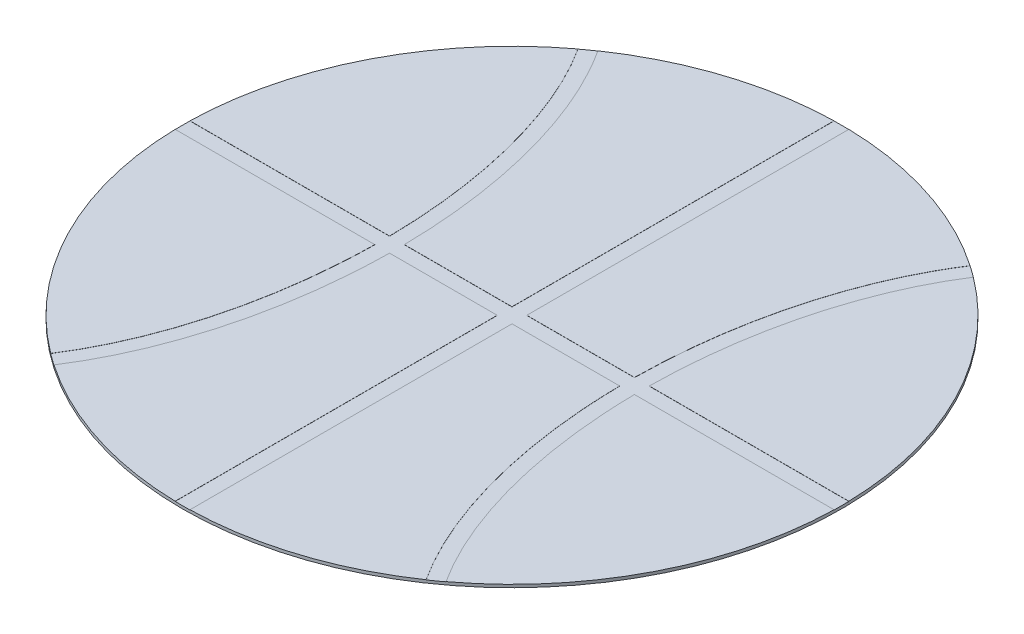
ISO-10303-21;
HEADER;
FILE_DESCRIPTION(('STEP AP214'),'2;1');
FILE_NAME('part.step','',(''),(''),'','','');
FILE_SCHEMA(('AUTOMOTIVE_DESIGN { 1 0 10303 214 1 1 1 1 }'));
ENDSEC;
DATA;
#1=APPLICATION_CONTEXT('core data for automotive mechanical design processes');
#2=APPLICATION_PROTOCOL_DEFINITION('international standard','automotive_design',2000,#1);
#3=PRODUCT_CONTEXT('',#1,'mechanical');
#4=PRODUCT('Part','Part','',(#3));
#5=PRODUCT_RELATED_PRODUCT_CATEGORY('part','',(#4));
#6=PRODUCT_DEFINITION_FORMATION('','',#4);
#7=PRODUCT_DEFINITION_CONTEXT('part definition',#1,'design');
#8=PRODUCT_DEFINITION('design','',#6,#7);
#9=PRODUCT_DEFINITION_SHAPE('','',#8);
#10=(LENGTH_UNIT() NAMED_UNIT(*) SI_UNIT(.MILLI.,.METRE.));
#11=(NAMED_UNIT(*) PLANE_ANGLE_UNIT() SI_UNIT($,.RADIAN.));
#12=(NAMED_UNIT(*) SI_UNIT($,.STERADIAN.) SOLID_ANGLE_UNIT());
#13=UNCERTAINTY_MEASURE_WITH_UNIT(LENGTH_MEASURE(1.E-05),#10,'distance_accuracy_value','');
#14=(GEOMETRIC_REPRESENTATION_CONTEXT(3) GLOBAL_UNCERTAINTY_ASSIGNED_CONTEXT((#13)) GLOBAL_UNIT_ASSIGNED_CONTEXT((#10,
#11,#12)) REPRESENTATION_CONTEXT('',''));
#15=CARTESIAN_POINT('',(0.,0.,0.));
#16=DIRECTION('',(0.,0.,1.));
#17=DIRECTION('',(1.,0.,0.));
#18=AXIS2_PLACEMENT_3D('',#15,#16,#17);
#19=CARTESIAN_POINT('',(0.,0.2,0.));
#20=DIRECTION('',(0.,-1.,0.));
#21=DIRECTION('',(0.,0.,-1.));
#22=AXIS2_PLACEMENT_3D('',#19,#20,#21);
#23=CYLINDRICAL_SURFACE('',#22,22.3);
#24=CARTESIAN_POINT('',(0.,0.,0.));
#25=DIRECTION('',(0.,1.,0.));
#26=DIRECTION('',(0.,0.,1.));
#27=AXIS2_PLACEMENT_3D('',#24,#25,#26);
#28=CIRCLE('',#27,22.3);
#29=CARTESIAN_POINT('',(0.,0.,22.3));
#30=VERTEX_POINT('',#29);
#31=EDGE_CURVE('E35',#30,#30,#28,.T.);
#32=ORIENTED_EDGE('',*,*,#31,.T.);
#33=EDGE_LOOP('',(#32));
#34=FACE_BOUND('',#33,.T.);
#35=CARTESIAN_POINT('',(0.,0.2,0.));
#36=DIRECTION('',(0.,1.,0.));
#37=DIRECTION('',(0.,0.,1.));
#38=AXIS2_PLACEMENT_3D('',#35,#36,#37);
#39=CIRCLE('',#38,22.3);
#40=CARTESIAN_POINT('',(13.3767482010341,0.2,17.8424383862221));
#41=VERTEX_POINT('',#40);
#42=CARTESIAN_POINT('',(22.294393914166,0.2,0.499999999999994));
#43=VERTEX_POINT('',#42);
#44=EDGE_CURVE('E40',#41,#43,#39,.T.);
#45=ORIENTED_EDGE('',*,*,#44,.F.);
#46=DIRECTION('',(0.,1.,0.));
#47=VECTOR('',#46,1.);
#48=CARTESIAN_POINT('',(13.3767482010341,0.19,17.8424383862221));
#49=LINE('',#48,#47);
#50=CARTESIAN_POINT('',(13.3767482010341,0.19,17.8424383862221));
#51=VERTEX_POINT('',#50);
#52=EDGE_CURVE('E322',#51,#41,#49,.T.);
#53=ORIENTED_EDGE('',*,*,#52,.F.);
#54=CARTESIAN_POINT('',(0.,0.19,0.));
#55=DIRECTION('',(0.,1.,0.));
#56=DIRECTION('',(0.,0.,1.));
#57=AXIS2_PLACEMENT_3D('',#54,#55,#56);
#58=CIRCLE('',#57,22.3);
#59=CARTESIAN_POINT('',(12.591992016773,0.19,18.4046661759872));
#60=VERTEX_POINT('',#59);
#61=EDGE_CURVE('E514',#60,#51,#58,.T.);
#62=ORIENTED_EDGE('',*,*,#61,.F.);
#63=DIRECTION('',(0.,1.,0.));
#64=VECTOR('',#63,1.);
#65=CARTESIAN_POINT('',(12.591992016773,0.19,18.4046661759872));
#66=LINE('',#65,#64);
#67=CARTESIAN_POINT('',(12.591992016773,0.2,18.4046661759872));
#68=VERTEX_POINT('',#67);
#69=EDGE_CURVE('E324',#60,#68,#66,.T.);
#70=ORIENTED_EDGE('',*,*,#69,.T.);
#71=CARTESIAN_POINT('',(0.500000000000003,0.2,22.294393914166));
#72=VERTEX_POINT('',#71);
#73=EDGE_CURVE('E11',#72,#68,#39,.T.);
#74=ORIENTED_EDGE('',*,*,#73,.F.);
#75=DIRECTION('',(0.,1.,0.));
#76=VECTOR('',#75,1.);
#77=CARTESIAN_POINT('',(0.500000000000003,0.19,22.294393914166));
#78=LINE('',#77,#76);
#79=CARTESIAN_POINT('',(0.500000000000003,0.19,22.294393914166));
#80=VERTEX_POINT('',#79);
#81=EDGE_CURVE('E331',#80,#72,#78,.T.);
#82=ORIENTED_EDGE('',*,*,#81,.F.);
#83=CARTESIAN_POINT('',(0.,0.19,0.));
#84=DIRECTION('',(0.,1.,0.));
#85=DIRECTION('',(0.,0.,1.));
#86=AXIS2_PLACEMENT_3D('',#83,#84,#85);
#87=CIRCLE('',#86,22.3);
#88=CARTESIAN_POINT('',(-0.499999999999997,0.19,22.294393914166));
#89=VERTEX_POINT('',#88);
#90=EDGE_CURVE('E492',#89,#80,#87,.T.);
#91=ORIENTED_EDGE('',*,*,#90,.F.);
#92=DIRECTION('',(0.,1.,0.));
#93=VECTOR('',#92,1.);
#94=CARTESIAN_POINT('',(-0.499999999999997,0.19,22.294393914166));
#95=LINE('',#94,#93);
#96=CARTESIAN_POINT('',(-0.499999999999997,0.2,22.294393914166));
#97=VERTEX_POINT('',#96);
#98=EDGE_CURVE('E333',#89,#97,#95,.T.);
#99=ORIENTED_EDGE('',*,*,#98,.T.);
#100=CARTESIAN_POINT('',(-12.591992016773,0.2,18.4046661759872));
#101=VERTEX_POINT('',#100);
#102=EDGE_CURVE('E41',#101,#97,#39,.T.);
#103=ORIENTED_EDGE('',*,*,#102,.F.);
#104=DIRECTION('',(0.,1.,0.));
#105=VECTOR('',#104,1.);
#106=CARTESIAN_POINT('',(-12.591992016773,0.19,18.4046661759872));
#107=LINE('',#106,#105);
#108=CARTESIAN_POINT('',(-12.591992016773,0.19,18.4046661759872));
#109=VERTEX_POINT('',#108);
#110=EDGE_CURVE('E340',#109,#101,#107,.T.);
#111=ORIENTED_EDGE('',*,*,#110,.F.);
#112=CARTESIAN_POINT('',(0.,0.19,0.));
#113=DIRECTION('',(0.,1.,0.));
#114=DIRECTION('',(0.,0.,1.));
#115=AXIS2_PLACEMENT_3D('',#112,#113,#114);
#116=CIRCLE('',#115,22.3);
#117=CARTESIAN_POINT('',(-13.3767482010341,0.19,17.8424383862221));
#118=VERTEX_POINT('',#117);
#119=EDGE_CURVE('E431',#118,#109,#116,.T.);
#120=ORIENTED_EDGE('',*,*,#119,.F.);
#121=DIRECTION('',(0.,1.,0.));
#122=VECTOR('',#121,1.);
#123=CARTESIAN_POINT('',(-13.3767482010341,0.19,17.8424383862221));
#124=LINE('',#123,#122);
#125=CARTESIAN_POINT('',(-13.3767482010341,0.2,17.8424383862221));
#126=VERTEX_POINT('',#125);
#127=EDGE_CURVE('E342',#118,#126,#124,.T.);
#128=ORIENTED_EDGE('',*,*,#127,.T.);
#129=CARTESIAN_POINT('',(-22.294393914166,0.2,0.499999999999999));
#130=VERTEX_POINT('',#129);
#131=EDGE_CURVE('E480',#130,#126,#39,.T.);
#132=ORIENTED_EDGE('',*,*,#131,.F.);
#133=DIRECTION('',(0.,1.,0.));
#134=VECTOR('',#133,1.);
#135=CARTESIAN_POINT('',(-22.294393914166,0.19,0.499999999999999));
#136=LINE('',#135,#134);
#137=CARTESIAN_POINT('',(-22.294393914166,0.19,0.499999999999999));
#138=VERTEX_POINT('',#137);
#139=EDGE_CURVE('E347',#138,#130,#136,.T.);
#140=ORIENTED_EDGE('',*,*,#139,.F.);
#141=CARTESIAN_POINT('',(0.,0.19,0.));
#142=DIRECTION('',(0.,1.,0.));
#143=DIRECTION('',(0.,0.,1.));
#144=AXIS2_PLACEMENT_3D('',#141,#142,#143);
#145=CIRCLE('',#144,22.3);
#146=CARTESIAN_POINT('',(-22.294393914166,0.19,-0.500000000000001));
#147=VERTEX_POINT('',#146);
#148=EDGE_CURVE('E418',#147,#138,#145,.T.);
#149=ORIENTED_EDGE('',*,*,#148,.F.);
#150=DIRECTION('',(0.,1.,0.));
#151=VECTOR('',#150,1.);
#152=CARTESIAN_POINT('',(-22.294393914166,0.19,-0.500000000000001));
#153=LINE('',#152,#151);
#154=CARTESIAN_POINT('',(-22.294393914166,0.2,-0.500000000000001));
#155=VERTEX_POINT('',#154);
#156=EDGE_CURVE('E349',#147,#155,#153,.T.);
#157=ORIENTED_EDGE('',*,*,#156,.T.);
#158=CARTESIAN_POINT('',(-13.3767482010341,0.2,-17.8424383862221));
#159=VERTEX_POINT('',#158);
#160=EDGE_CURVE('E358',#159,#155,#39,.T.);
#161=ORIENTED_EDGE('',*,*,#160,.F.);
#162=DIRECTION('',(0.,1.,0.));
#163=VECTOR('',#162,1.);
#164=CARTESIAN_POINT('',(-13.3767482010341,0.19,-17.8424383862221));
#165=LINE('',#164,#163);
#166=CARTESIAN_POINT('',(-13.3767482010341,0.19,-17.8424383862221));
#167=VERTEX_POINT('',#166);
#168=EDGE_CURVE('E141',#167,#159,#165,.T.);
#169=ORIENTED_EDGE('',*,*,#168,.F.);
#170=CARTESIAN_POINT('',(0.,0.19,0.));
#171=DIRECTION('',(0.,1.,0.));
#172=DIRECTION('',(0.,0.,1.));
#173=AXIS2_PLACEMENT_3D('',#170,#171,#172);
#174=CIRCLE('',#173,22.3);
#175=CARTESIAN_POINT('',(-12.591992016773,0.19,-18.4046661759872));
#176=VERTEX_POINT('',#175);
#177=EDGE_CURVE('E239',#176,#167,#174,.T.);
#178=ORIENTED_EDGE('',*,*,#177,.F.);
#179=DIRECTION('',(0.,1.,0.));
#180=VECTOR('',#179,1.);
#181=CARTESIAN_POINT('',(-12.591992016773,0.19,-18.4046661759872));
#182=LINE('',#181,#180);
#183=CARTESIAN_POINT('',(-12.591992016773,0.2,-18.4046661759872));
#184=VERTEX_POINT('',#183);
#185=EDGE_CURVE('E230',#176,#184,#182,.T.);
#186=ORIENTED_EDGE('',*,*,#185,.T.);
#187=CARTESIAN_POINT('',(-0.500000000000003,0.2,-22.294393914166));
#188=VERTEX_POINT('',#187);
#189=EDGE_CURVE('E296',#188,#184,#39,.T.);
#190=ORIENTED_EDGE('',*,*,#189,.F.);
#191=DIRECTION('',(0.,1.,0.));
#192=VECTOR('',#191,1.);
#193=CARTESIAN_POINT('',(-0.500000000000003,0.19,-22.294393914166));
#194=LINE('',#193,#192);
#195=CARTESIAN_POINT('',(-0.500000000000003,0.19,-22.294393914166));
#196=VERTEX_POINT('',#195);
#197=EDGE_CURVE('E293',#196,#188,#194,.T.);
#198=ORIENTED_EDGE('',*,*,#197,.F.);
#199=CARTESIAN_POINT('',(0.,0.19,0.));
#200=DIRECTION('',(0.,1.,0.));
#201=DIRECTION('',(0.,0.,1.));
#202=AXIS2_PLACEMENT_3D('',#199,#200,#201);
#203=CIRCLE('',#202,22.3);
#204=CARTESIAN_POINT('',(0.499999999999997,0.19,-22.294393914166));
#205=VERTEX_POINT('',#204);
#206=EDGE_CURVE('E245',#205,#196,#203,.T.);
#207=ORIENTED_EDGE('',*,*,#206,.F.);
#208=DIRECTION('',(0.,1.,0.));
#209=VECTOR('',#208,1.);
#210=CARTESIAN_POINT('',(0.499999999999997,0.19,-22.294393914166));
#211=LINE('',#210,#209);
#212=CARTESIAN_POINT('',(0.499999999999997,0.2,-22.294393914166));
#213=VERTEX_POINT('',#212);
#214=EDGE_CURVE('E299',#205,#213,#211,.T.);
#215=ORIENTED_EDGE('',*,*,#214,.T.);
#216=CARTESIAN_POINT('',(12.591992016773,0.2,-18.4046661759872));
#217=VERTEX_POINT('',#216);
#218=EDGE_CURVE('E474',#217,#213,#39,.T.);
#219=ORIENTED_EDGE('',*,*,#218,.F.);
#220=DIRECTION('',(0.,1.,0.));
#221=VECTOR('',#220,1.);
#222=CARTESIAN_POINT('',(12.591992016773,0.19,-18.4046661759872));
#223=LINE('',#222,#221);
#224=CARTESIAN_POINT('',(12.591992016773,0.19,-18.4046661759872));
#225=VERTEX_POINT('',#224);
#226=EDGE_CURVE('E308',#225,#217,#223,.T.);
#227=ORIENTED_EDGE('',*,*,#226,.F.);
#228=CARTESIAN_POINT('',(0.,0.19,0.));
#229=DIRECTION('',(0.,1.,0.));
#230=DIRECTION('',(0.,0.,1.));
#231=AXIS2_PLACEMENT_3D('',#228,#229,#230);
#232=CIRCLE('',#231,22.3);
#233=CARTESIAN_POINT('',(13.3767482010341,0.19,-17.8424383862221));
#234=VERTEX_POINT('',#233);
#235=EDGE_CURVE('E283',#234,#225,#232,.T.);
#236=ORIENTED_EDGE('',*,*,#235,.F.);
#237=DIRECTION('',(0.,1.,0.));
#238=VECTOR('',#237,1.);
#239=CARTESIAN_POINT('',(13.3767482010341,0.19,-17.8424383862221));
#240=LINE('',#239,#238);
#241=CARTESIAN_POINT('',(13.3767482010341,0.2,-17.8424383862221));
#242=VERTEX_POINT('',#241);
#243=EDGE_CURVE('E310',#234,#242,#240,.T.);
#244=ORIENTED_EDGE('',*,*,#243,.T.);
#245=CARTESIAN_POINT('',(22.294393914166,0.2,-0.500000000000006));
#246=VERTEX_POINT('',#245);
#247=EDGE_CURVE('E478',#246,#242,#39,.T.);
#248=ORIENTED_EDGE('',*,*,#247,.F.);
#249=DIRECTION('',(0.,1.,0.));
#250=VECTOR('',#249,1.);
#251=CARTESIAN_POINT('',(22.294393914166,0.19,-0.500000000000006));
#252=LINE('',#251,#250);
#253=CARTESIAN_POINT('',(22.294393914166,0.19,-0.500000000000006));
#254=VERTEX_POINT('',#253);
#255=EDGE_CURVE('E315',#254,#246,#252,.T.);
#256=ORIENTED_EDGE('',*,*,#255,.F.);
#257=CARTESIAN_POINT('',(0.,0.19,0.));
#258=DIRECTION('',(0.,1.,0.));
#259=DIRECTION('',(0.,0.,1.));
#260=AXIS2_PLACEMENT_3D('',#257,#258,#259);
#261=CIRCLE('',#260,22.3);
#262=CARTESIAN_POINT('',(22.294393914166,0.19,0.499999999999994));
#263=VERTEX_POINT('',#262);
#264=EDGE_CURVE('E572',#263,#254,#261,.T.);
#265=ORIENTED_EDGE('',*,*,#264,.F.);
#266=DIRECTION('',(0.,1.,0.));
#267=VECTOR('',#266,1.);
#268=CARTESIAN_POINT('',(22.294393914166,0.19,0.499999999999994));
#269=LINE('',#268,#267);
#270=EDGE_CURVE('E317',#263,#43,#269,.T.);
#271=ORIENTED_EDGE('',*,*,#270,.T.);
#272=EDGE_LOOP('',(#45,#53,#62,#70,#74,#82,#91,#99,#103,#111,#120,#128,#132,#140,#149,#157,#161,
#169,#178,#186,#190,#198,#207,#215,#219,#227,#236,#244,#248,#256,#265,#271));
#273=FACE_BOUND('',#272,.T.);
#274=ADVANCED_FACE('F32',(#34,#273),#23,.T.);
#275=CARTESIAN_POINT('',(0.,0.2,0.));
#276=DIRECTION('',(0.,1.,0.));
#277=DIRECTION('',(0.,0.,1.));
#278=AXIS2_PLACEMENT_3D('',#275,#276,#277);
#279=PLANE('',#278);
#280=ORIENTED_EDGE('',*,*,#218,.T.);
#281=DIRECTION('',(0.,0.,1.));
#282=VECTOR('',#281,1.);
#283=CARTESIAN_POINT('',(0.5,0.2,0.));
#284=LINE('',#283,#282);
#285=CARTESIAN_POINT('',(0.5,0.2,-0.500000000000005));
#286=VERTEX_POINT('',#285);
#287=EDGE_CURVE('E368',#213,#286,#284,.T.);
#288=ORIENTED_EDGE('',*,*,#287,.T.);
#289=DIRECTION('',(-1.,0.,0.));
#290=VECTOR('',#289,1.);
#291=CARTESIAN_POINT('',(0.,0.2,-0.500000000000004));
#292=LINE('',#291,#290);
#293=CARTESIAN_POINT('',(7.78559095930401,0.2,-0.500000000000005));
#294=VERTEX_POINT('',#293);
#295=EDGE_CURVE('E371',#294,#286,#292,.T.);
#296=ORIENTED_EDGE('',*,*,#295,.F.);
#297=CARTESIAN_POINT('',(22.3,0.2,0.));
#298=DIRECTION('',(0.,-1.,0.));
#299=DIRECTION('',(0.,0.,-1.));
#300=AXIS2_PLACEMENT_3D('',#297,#298,#299);
#301=ELLIPSE('',#300,24.7535135657918,14.5173709283897);
#302=EDGE_CURVE('E374',#294,#217,#301,.T.);
#303=ORIENTED_EDGE('',*,*,#302,.T.);
#304=EDGE_LOOP('',(#280,#288,#296,#303));
#305=FACE_BOUND('',#304,.T.);
#306=ADVANCED_FACE('F454',(#305),#279,.T.);
#307=CARTESIAN_POINT('',(-22.3,0.2,0.));
#308=DIRECTION('',(0.,1.,0.));
#309=DIRECTION('',(0.,0.,-1.));
#310=AXIS2_PLACEMENT_3D('',#307,#308,#309);
#311=ELLIPSE('',#310,24.7535135657918,14.5173709283897);
#312=CARTESIAN_POINT('',(-7.78559095930401,0.2,-0.500000000000003));
#313=VERTEX_POINT('',#312);
#314=EDGE_CURVE('E363',#313,#184,#311,.T.);
#315=ORIENTED_EDGE('',*,*,#314,.F.);
#316=DIRECTION('',(-1.,0.,0.));
#317=VECTOR('',#316,1.);
#318=CARTESIAN_POINT('',(0.,0.2,-0.500000000000004));
#319=LINE('',#318,#317);
#320=CARTESIAN_POINT('',(-0.5,0.2,-0.500000000000002));
#321=VERTEX_POINT('',#320);
#322=EDGE_CURVE('E227',#321,#313,#319,.T.);
#323=ORIENTED_EDGE('',*,*,#322,.F.);
#324=DIRECTION('',(0.,0.,1.));
#325=VECTOR('',#324,1.);
#326=CARTESIAN_POINT('',(-0.5,0.2,0.));
#327=LINE('',#326,#325);
#328=EDGE_CURVE('E366',#188,#321,#327,.T.);
#329=ORIENTED_EDGE('',*,*,#328,.F.);
#330=ORIENTED_EDGE('',*,*,#189,.T.);
#331=EDGE_LOOP('',(#315,#323,#329,#330));
#332=FACE_BOUND('',#331,.T.);
#333=ADVANCED_FACE('F465',(#332),#279,.T.);
#334=ORIENTED_EDGE('',*,*,#44,.T.);
#335=DIRECTION('',(-1.,0.,0.));
#336=VECTOR('',#335,1.);
#337=CARTESIAN_POINT('',(0.,0.2,0.499999999999996));
#338=LINE('',#337,#336);
#339=CARTESIAN_POINT('',(8.7856240565459,0.2,0.499999999999995));
#340=VERTEX_POINT('',#339);
#341=EDGE_CURVE('E382',#43,#340,#338,.T.);
#342=ORIENTED_EDGE('',*,*,#341,.T.);
#343=CARTESIAN_POINT('',(22.3,0.2,0.));
#344=DIRECTION('',(0.,-1.,0.));
#345=DIRECTION('',(0.,0.,-1.));
#346=AXIS2_PLACEMENT_3D('',#343,#344,#345);
#347=ELLIPSE('',#346,23.7535135657918,13.5173709283897);
#348=EDGE_CURVE('E385',#41,#340,#347,.T.);
#349=ORIENTED_EDGE('',*,*,#348,.F.);
#350=EDGE_LOOP('',(#334,#342,#349));
#351=FACE_BOUND('',#350,.T.);
#352=ADVANCED_FACE('F470',(#351),#279,.T.);
#353=ORIENTED_EDGE('',*,*,#73,.T.);
#354=CARTESIAN_POINT('',(22.3,0.2,0.));
#355=DIRECTION('',(0.,-1.,0.));
#356=DIRECTION('',(0.,0.,-1.));
#357=AXIS2_PLACEMENT_3D('',#354,#355,#356);
#358=ELLIPSE('',#357,24.7535135657918,14.5173709283897);
#359=CARTESIAN_POINT('',(7.78559095930401,0.2,0.499999999999995));
#360=VERTEX_POINT('',#359);
#361=EDGE_CURVE('E388',#68,#360,#358,.T.);
#362=ORIENTED_EDGE('',*,*,#361,.T.);
#363=DIRECTION('',(-1.,0.,0.));
#364=VECTOR('',#363,1.);
#365=CARTESIAN_POINT('',(0.,0.2,0.499999999999996));
#366=LINE('',#365,#364);
#367=CARTESIAN_POINT('',(0.5,0.2,0.499999999999995));
#368=VERTEX_POINT('',#367);
#369=EDGE_CURVE('E391',#360,#368,#366,.T.);
#370=ORIENTED_EDGE('',*,*,#369,.T.);
#371=DIRECTION('',(0.,0.,1.));
#372=VECTOR('',#371,1.);
#373=CARTESIAN_POINT('',(0.5,0.2,0.));
#374=LINE('',#373,#372);
#375=EDGE_CURVE('E394',#368,#72,#374,.T.);
#376=ORIENTED_EDGE('',*,*,#375,.T.);
#377=EDGE_LOOP('',(#353,#362,#370,#376));
#378=FACE_BOUND('',#377,.T.);
#379=ADVANCED_FACE('F553',(#378),#279,.T.);
#380=CARTESIAN_POINT('',(22.3,0.2,0.));
#381=DIRECTION('',(0.,-1.,0.));
#382=DIRECTION('',(0.,0.,-1.));
#383=AXIS2_PLACEMENT_3D('',#380,#381,#382);
#384=ELLIPSE('',#383,23.7535135657918,13.5173709283897);
#385=CARTESIAN_POINT('',(8.7856240565459,0.2,-0.500000000000005));
#386=VERTEX_POINT('',#385);
#387=EDGE_CURVE('E377',#386,#242,#384,.T.);
#388=ORIENTED_EDGE('',*,*,#387,.F.);
#389=DIRECTION('',(-1.,0.,0.));
#390=VECTOR('',#389,1.);
#391=CARTESIAN_POINT('',(0.,0.2,-0.500000000000004));
#392=LINE('',#391,#390);
#393=EDGE_CURVE('E379',#246,#386,#392,.T.);
#394=ORIENTED_EDGE('',*,*,#393,.F.);
#395=ORIENTED_EDGE('',*,*,#247,.T.);
#396=EDGE_LOOP('',(#388,#394,#395));
#397=FACE_BOUND('',#396,.T.);
#398=ADVANCED_FACE('F548',(#397),#279,.T.);
#399=ORIENTED_EDGE('',*,*,#131,.T.);
#400=CARTESIAN_POINT('',(-22.3,0.2,0.));
#401=DIRECTION('',(0.,1.,0.));
#402=DIRECTION('',(0.,0.,-1.));
#403=AXIS2_PLACEMENT_3D('',#400,#401,#402);
#404=ELLIPSE('',#403,23.7535135657918,13.5173709283897);
#405=CARTESIAN_POINT('',(-8.7856240565459,0.2,0.499999999999998));
#406=VERTEX_POINT('',#405);
#407=EDGE_CURVE('E405',#126,#406,#404,.T.);
#408=ORIENTED_EDGE('',*,*,#407,.T.);
#409=DIRECTION('',(-1.,0.,0.));
#410=VECTOR('',#409,1.);
#411=CARTESIAN_POINT('',(0.,0.2,0.499999999999996));
#412=LINE('',#411,#410);
#413=EDGE_CURVE('E408',#406,#130,#412,.T.);
#414=ORIENTED_EDGE('',*,*,#413,.T.);
#415=EDGE_LOOP('',(#399,#408,#414));
#416=FACE_BOUND('',#415,.T.);
#417=ADVANCED_FACE('F546',(#416),#279,.T.);
#418=DIRECTION('',(-1.,0.,0.));
#419=VECTOR('',#418,1.);
#420=CARTESIAN_POINT('',(0.,0.2,-0.500000000000004));
#421=LINE('',#420,#419);
#422=CARTESIAN_POINT('',(-8.7856240565459,0.2,-0.500000000000003));
#423=VERTEX_POINT('',#422);
#424=EDGE_CURVE('E411',#423,#155,#421,.T.);
#425=ORIENTED_EDGE('',*,*,#424,.F.);
#426=CARTESIAN_POINT('',(-22.3,0.2,0.));
#427=DIRECTION('',(0.,1.,0.));
#428=DIRECTION('',(0.,0.,-1.));
#429=AXIS2_PLACEMENT_3D('',#426,#427,#428);
#430=ELLIPSE('',#429,23.7535135657918,13.5173709283897);
#431=EDGE_CURVE('E48',#423,#159,#430,.T.);
#432=ORIENTED_EDGE('',*,*,#431,.T.);
#433=ORIENTED_EDGE('',*,*,#160,.T.);
#434=EDGE_LOOP('',(#425,#432,#433));
#435=FACE_BOUND('',#434,.T.);
#436=ADVANCED_FACE('F413',(#435),#279,.T.);
#437=DIRECTION('',(0.,0.,1.));
#438=VECTOR('',#437,1.);
#439=CARTESIAN_POINT('',(-0.5,0.2,0.));
#440=LINE('',#439,#438);
#441=CARTESIAN_POINT('',(-0.5,0.2,0.499999999999998));
#442=VERTEX_POINT('',#441);
#443=EDGE_CURVE('E397',#442,#97,#440,.T.);
#444=ORIENTED_EDGE('',*,*,#443,.F.);
#445=DIRECTION('',(-1.,0.,0.));
#446=VECTOR('',#445,1.);
#447=CARTESIAN_POINT('',(0.,0.2,0.499999999999996));
#448=LINE('',#447,#446);
#449=CARTESIAN_POINT('',(-7.78559095930401,0.2,0.499999999999997));
#450=VERTEX_POINT('',#449);
#451=EDGE_CURVE('E399',#442,#450,#448,.T.);
#452=ORIENTED_EDGE('',*,*,#451,.T.);
#453=CARTESIAN_POINT('',(-22.3,0.2,0.));
#454=DIRECTION('',(0.,1.,0.));
#455=DIRECTION('',(0.,0.,-1.));
#456=AXIS2_PLACEMENT_3D('',#453,#454,#455);
#457=ELLIPSE('',#456,24.7535135657918,14.5173709283897);
#458=EDGE_CURVE('E402',#101,#450,#457,.T.);
#459=ORIENTED_EDGE('',*,*,#458,.F.);
#460=ORIENTED_EDGE('',*,*,#102,.T.);
#461=EDGE_LOOP('',(#444,#452,#459,#460));
#462=FACE_BOUND('',#461,.T.);
#463=ADVANCED_FACE('F450',(#462),#279,.T.);
#464=CARTESIAN_POINT('',(0.,0.,0.));
#465=DIRECTION('',(0.,1.,0.));
#466=DIRECTION('',(0.,0.,1.));
#467=AXIS2_PLACEMENT_3D('',#464,#465,#466);
#468=PLANE('',#467);
#469=ORIENTED_EDGE('',*,*,#31,.F.);
#470=EDGE_LOOP('',(#469));
#471=FACE_BOUND('',#470,.T.);
#472=ADVANCED_FACE('F449',(#471),#468,.F.);
#473=CARTESIAN_POINT('',(-22.3,0.19,0.));
#474=DIRECTION('',(0.,1.,0.));
#475=DIRECTION('',(0.,0.,-1.));
#476=AXIS2_PLACEMENT_3D('',#473,#474,#475);
#477=ELLIPSE('',#476,23.7535135657918,13.5173709283897);
#478=DIRECTION('',(0.,1.,0.));
#479=VECTOR('',#478,1.);
#480=SURFACE_OF_LINEAR_EXTRUSION('',#477,#479);
#481=ORIENTED_EDGE('',*,*,#431,.F.);
#482=DIRECTION('',(0.,1.,0.));
#483=VECTOR('',#482,1.);
#484=CARTESIAN_POINT('',(-8.7856240565459,0.19,-0.500000000000003));
#485=LINE('',#484,#483);
#486=CARTESIAN_POINT('',(-8.7856240565459,0.19,-0.500000000000003));
#487=VERTEX_POINT('',#486);
#488=EDGE_CURVE('E144',#487,#423,#485,.T.);
#489=ORIENTED_EDGE('',*,*,#488,.F.);
#490=EDGE_CURVE('E54',#487,#167,#477,.T.);
#491=ORIENTED_EDGE('',*,*,#490,.T.);
#492=ORIENTED_EDGE('',*,*,#168,.T.);
#493=EDGE_LOOP('',(#481,#489,#491,#492));
#494=FACE_BOUND('',#493,.T.);
#495=ADVANCED_FACE('F255',(#494),#480,.T.);
#496=CARTESIAN_POINT('',(-22.3,0.19,0.));
#497=DIRECTION('',(0.,1.,0.));
#498=DIRECTION('',(0.,0.,-1.));
#499=AXIS2_PLACEMENT_3D('',#496,#497,#498);
#500=ELLIPSE('',#499,24.7535135657918,14.5173709283897);
#501=DIRECTION('',(0.,1.,0.));
#502=VECTOR('',#501,1.);
#503=SURFACE_OF_LINEAR_EXTRUSION('',#500,#502);
#504=ORIENTED_EDGE('',*,*,#314,.T.);
#505=ORIENTED_EDGE('',*,*,#185,.F.);
#506=CARTESIAN_POINT('',(-7.78559095930401,0.19,-0.500000000000003));
#507=VERTEX_POINT('',#506);
#508=EDGE_CURVE('E234',#507,#176,#500,.T.);
#509=ORIENTED_EDGE('',*,*,#508,.F.);
#510=DIRECTION('',(0.,1.,0.));
#511=VECTOR('',#510,1.);
#512=CARTESIAN_POINT('',(-7.78559095930401,0.19,-0.500000000000003));
#513=LINE('',#512,#511);
#514=EDGE_CURVE('E220',#507,#313,#513,.T.);
#515=ORIENTED_EDGE('',*,*,#514,.T.);
#516=EDGE_LOOP('',(#504,#505,#509,#515));
#517=FACE_BOUND('',#516,.T.);
#518=ADVANCED_FACE('F235',(#517),#503,.F.);
#519=CARTESIAN_POINT('',(0.,0.19,-0.500000000000004));
#520=DIRECTION('',(0.,0.,-1.));
#521=DIRECTION('',(-1.,0.,0.));
#522=AXIS2_PLACEMENT_3D('',#519,#520,#521);
#523=PLANE('',#522);
#524=ORIENTED_EDGE('',*,*,#322,.T.);
#525=ORIENTED_EDGE('',*,*,#514,.F.);
#526=DIRECTION('',(-1.,0.,0.));
#527=VECTOR('',#526,1.);
#528=CARTESIAN_POINT('',(0.,0.19,-0.500000000000004));
#529=LINE('',#528,#527);
#530=CARTESIAN_POINT('',(-0.5,0.19,-0.500000000000002));
#531=VERTEX_POINT('',#530);
#532=EDGE_CURVE('E224',#531,#507,#529,.T.);
#533=ORIENTED_EDGE('',*,*,#532,.F.);
#534=DIRECTION('',(0.,1.,0.));
#535=VECTOR('',#534,1.);
#536=CARTESIAN_POINT('',(-0.5,0.19,-0.500000000000002));
#537=LINE('',#536,#535);
#538=EDGE_CURVE('E231',#531,#321,#537,.T.);
#539=ORIENTED_EDGE('',*,*,#538,.T.);
#540=EDGE_LOOP('',(#524,#525,#533,#539));
#541=FACE_BOUND('',#540,.T.);
#542=ADVANCED_FACE('F222',(#541),#523,.F.);
#543=CARTESIAN_POINT('',(-0.5,0.19,0.));
#544=DIRECTION('',(-1.,0.,0.));
#545=DIRECTION('',(0.,0.,1.));
#546=AXIS2_PLACEMENT_3D('',#543,#544,#545);
#547=PLANE('',#546);
#548=ORIENTED_EDGE('',*,*,#328,.T.);
#549=ORIENTED_EDGE('',*,*,#538,.F.);
#550=DIRECTION('',(0.,0.,1.));
#551=VECTOR('',#550,1.);
#552=CARTESIAN_POINT('',(-0.5,0.19,0.));
#553=LINE('',#552,#551);
#554=EDGE_CURVE('E243',#196,#531,#553,.T.);
#555=ORIENTED_EDGE('',*,*,#554,.F.);
#556=ORIENTED_EDGE('',*,*,#197,.T.);
#557=EDGE_LOOP('',(#548,#549,#555,#556));
#558=FACE_BOUND('',#557,.T.);
#559=ADVANCED_FACE('F258',(#558),#547,.F.);
#560=CARTESIAN_POINT('',(0.5,0.19,0.));
#561=DIRECTION('',(-1.,0.,0.));
#562=DIRECTION('',(0.,0.,1.));
#563=AXIS2_PLACEMENT_3D('',#560,#561,#562);
#564=PLANE('',#563);
#565=ORIENTED_EDGE('',*,*,#287,.F.);
#566=ORIENTED_EDGE('',*,*,#214,.F.);
#567=DIRECTION('',(0.,0.,1.));
#568=VECTOR('',#567,1.);
#569=CARTESIAN_POINT('',(0.5,0.19,0.));
#570=LINE('',#569,#568);
#571=CARTESIAN_POINT('',(0.5,0.19,-0.500000000000005));
#572=VERTEX_POINT('',#571);
#573=EDGE_CURVE('E286',#205,#572,#570,.T.);
#574=ORIENTED_EDGE('',*,*,#573,.T.);
#575=DIRECTION('',(0.,1.,0.));
#576=VECTOR('',#575,1.);
#577=CARTESIAN_POINT('',(0.5,0.19,-0.500000000000005));
#578=LINE('',#577,#576);
#579=EDGE_CURVE('E302',#572,#286,#578,.T.);
#580=ORIENTED_EDGE('',*,*,#579,.T.);
#581=EDGE_LOOP('',(#565,#566,#574,#580));
#582=FACE_BOUND('',#581,.T.);
#583=ADVANCED_FACE('F261',(#582),#564,.T.);
#584=CARTESIAN_POINT('',(0.,0.19,-0.500000000000004));
#585=DIRECTION('',(0.,0.,-1.));
#586=DIRECTION('',(-1.,0.,0.));
#587=AXIS2_PLACEMENT_3D('',#584,#585,#586);
#588=PLANE('',#587);
#589=ORIENTED_EDGE('',*,*,#295,.T.);
#590=ORIENTED_EDGE('',*,*,#579,.F.);
#591=DIRECTION('',(-1.,0.,0.));
#592=VECTOR('',#591,1.);
#593=CARTESIAN_POINT('',(0.,0.19,-0.500000000000004));
#594=LINE('',#593,#592);
#595=CARTESIAN_POINT('',(7.78559095930401,0.19,-0.500000000000005));
#596=VERTEX_POINT('',#595);
#597=EDGE_CURVE('E282',#596,#572,#594,.T.);
#598=ORIENTED_EDGE('',*,*,#597,.F.);
#599=DIRECTION('',(0.,1.,0.));
#600=VECTOR('',#599,1.);
#601=CARTESIAN_POINT('',(7.78559095930401,0.19,-0.500000000000005));
#602=LINE('',#601,#600);
#603=EDGE_CURVE('E306',#596,#294,#602,.T.);
#604=ORIENTED_EDGE('',*,*,#603,.T.);
#605=EDGE_LOOP('',(#589,#590,#598,#604));
#606=FACE_BOUND('',#605,.T.);
#607=ADVANCED_FACE('F265',(#606),#588,.F.);
#608=CARTESIAN_POINT('',(22.3,0.19,0.));
#609=DIRECTION('',(0.,-1.,0.));
#610=DIRECTION('',(0.,0.,-1.));
#611=AXIS2_PLACEMENT_3D('',#608,#609,#610);
#612=ELLIPSE('',#611,24.7535135657918,14.5173709283897);
#613=DIRECTION('',(0.,1.,0.));
#614=VECTOR('',#613,1.);
#615=SURFACE_OF_LINEAR_EXTRUSION('',#612,#614);
#616=ORIENTED_EDGE('',*,*,#302,.F.);
#617=ORIENTED_EDGE('',*,*,#603,.F.);
#618=EDGE_CURVE('E278',#596,#225,#612,.T.);
#619=ORIENTED_EDGE('',*,*,#618,.T.);
#620=ORIENTED_EDGE('',*,*,#226,.T.);
#621=EDGE_LOOP('',(#616,#617,#619,#620));
#622=FACE_BOUND('',#621,.T.);
#623=ADVANCED_FACE('F269',(#622),#615,.T.);
#624=CARTESIAN_POINT('',(22.3,0.19,0.));
#625=DIRECTION('',(0.,-1.,0.));
#626=DIRECTION('',(0.,0.,-1.));
#627=AXIS2_PLACEMENT_3D('',#624,#625,#626);
#628=ELLIPSE('',#627,23.7535135657918,13.5173709283897);
#629=DIRECTION('',(0.,1.,0.));
#630=VECTOR('',#629,1.);
#631=SURFACE_OF_LINEAR_EXTRUSION('',#628,#630);
#632=ORIENTED_EDGE('',*,*,#387,.T.);
#633=ORIENTED_EDGE('',*,*,#243,.F.);
#634=CARTESIAN_POINT('',(8.7856240565459,0.19,-0.500000000000005));
#635=VERTEX_POINT('',#634);
#636=EDGE_CURVE('E569',#635,#234,#628,.T.);
#637=ORIENTED_EDGE('',*,*,#636,.F.);
#638=DIRECTION('',(0.,1.,0.));
#639=VECTOR('',#638,1.);
#640=CARTESIAN_POINT('',(8.7856240565459,0.19,-0.500000000000005));
#641=LINE('',#640,#639);
#642=EDGE_CURVE('E313',#635,#386,#641,.T.);
#643=ORIENTED_EDGE('',*,*,#642,.T.);
#644=EDGE_LOOP('',(#632,#633,#637,#643));
#645=FACE_BOUND('',#644,.T.);
#646=ADVANCED_FACE('F274',(#645),#631,.F.);
#647=CARTESIAN_POINT('',(0.,0.19,-0.500000000000004));
#648=DIRECTION('',(0.,0.,-1.));
#649=DIRECTION('',(-1.,0.,0.));
#650=AXIS2_PLACEMENT_3D('',#647,#648,#649);
#651=PLANE('',#650);
#652=ORIENTED_EDGE('',*,*,#393,.T.);
#653=ORIENTED_EDGE('',*,*,#642,.F.);
#654=DIRECTION('',(-1.,0.,0.));
#655=VECTOR('',#654,1.);
#656=CARTESIAN_POINT('',(0.,0.19,-0.500000000000004));
#657=LINE('',#656,#655);
#658=EDGE_CURVE('E570',#254,#635,#657,.T.);
#659=ORIENTED_EDGE('',*,*,#658,.F.);
#660=ORIENTED_EDGE('',*,*,#255,.T.);
#661=EDGE_LOOP('',(#652,#653,#659,#660));
#662=FACE_BOUND('',#661,.T.);
#663=ADVANCED_FACE('F597',(#662),#651,.F.);
#664=CARTESIAN_POINT('',(0.,0.19,0.499999999999996));
#665=DIRECTION('',(0.,0.,-1.));
#666=DIRECTION('',(-1.,0.,0.));
#667=AXIS2_PLACEMENT_3D('',#664,#665,#666);
#668=PLANE('',#667);
#669=ORIENTED_EDGE('',*,*,#341,.F.);
#670=ORIENTED_EDGE('',*,*,#270,.F.);
#671=DIRECTION('',(-1.,0.,0.));
#672=VECTOR('',#671,1.);
#673=CARTESIAN_POINT('',(0.,0.19,0.499999999999996));
#674=LINE('',#673,#672);
#675=CARTESIAN_POINT('',(8.7856240565459,0.19,0.499999999999995));
#676=VERTEX_POINT('',#675);
#677=EDGE_CURVE('E578',#263,#676,#674,.T.);
#678=ORIENTED_EDGE('',*,*,#677,.T.);
#679=DIRECTION('',(0.,1.,0.));
#680=VECTOR('',#679,1.);
#681=CARTESIAN_POINT('',(8.7856240565459,0.19,0.499999999999995));
#682=LINE('',#681,#680);
#683=EDGE_CURVE('E320',#676,#340,#682,.T.);
#684=ORIENTED_EDGE('',*,*,#683,.T.);
#685=EDGE_LOOP('',(#669,#670,#678,#684));
#686=FACE_BOUND('',#685,.T.);
#687=ADVANCED_FACE('F594',(#686),#668,.T.);
#688=CARTESIAN_POINT('',(22.3,0.19,0.));
#689=DIRECTION('',(0.,-1.,0.));
#690=DIRECTION('',(0.,0.,-1.));
#691=AXIS2_PLACEMENT_3D('',#688,#689,#690);
#692=ELLIPSE('',#691,23.7535135657918,13.5173709283897);
#693=DIRECTION('',(0.,1.,0.));
#694=VECTOR('',#693,1.);
#695=SURFACE_OF_LINEAR_EXTRUSION('',#692,#694);
#696=ORIENTED_EDGE('',*,*,#348,.T.);
#697=ORIENTED_EDGE('',*,*,#683,.F.);
#698=EDGE_CURVE('E579',#51,#676,#692,.T.);
#699=ORIENTED_EDGE('',*,*,#698,.F.);
#700=ORIENTED_EDGE('',*,*,#52,.T.);
#701=EDGE_LOOP('',(#696,#697,#699,#700));
#702=FACE_BOUND('',#701,.T.);
#703=ADVANCED_FACE('F522',(#702),#695,.F.);
#704=CARTESIAN_POINT('',(22.3,0.19,0.));
#705=DIRECTION('',(0.,-1.,0.));
#706=DIRECTION('',(0.,0.,-1.));
#707=AXIS2_PLACEMENT_3D('',#704,#705,#706);
#708=ELLIPSE('',#707,24.7535135657918,14.5173709283897);
#709=DIRECTION('',(0.,1.,0.));
#710=VECTOR('',#709,1.);
#711=SURFACE_OF_LINEAR_EXTRUSION('',#708,#710);
#712=ORIENTED_EDGE('',*,*,#361,.F.);
#713=ORIENTED_EDGE('',*,*,#69,.F.);
#714=CARTESIAN_POINT('',(7.78559095930401,0.19,0.499999999999995));
#715=VERTEX_POINT('',#714);
#716=EDGE_CURVE('E511',#60,#715,#708,.T.);
#717=ORIENTED_EDGE('',*,*,#716,.T.);
#718=DIRECTION('',(0.,1.,0.));
#719=VECTOR('',#718,1.);
#720=CARTESIAN_POINT('',(7.78559095930401,0.19,0.499999999999995));
#721=LINE('',#720,#719);
#722=EDGE_CURVE('E327',#715,#360,#721,.T.);
#723=ORIENTED_EDGE('',*,*,#722,.T.);
#724=EDGE_LOOP('',(#712,#713,#717,#723));
#725=FACE_BOUND('',#724,.T.);
#726=ADVANCED_FACE('F517',(#725),#711,.T.);
#727=CARTESIAN_POINT('',(0.,0.19,0.499999999999996));
#728=DIRECTION('',(0.,0.,-1.));
#729=DIRECTION('',(-1.,0.,0.));
#730=AXIS2_PLACEMENT_3D('',#727,#728,#729);
#731=PLANE('',#730);
#732=ORIENTED_EDGE('',*,*,#369,.F.);
#733=ORIENTED_EDGE('',*,*,#722,.F.);
#734=DIRECTION('',(-1.,0.,0.));
#735=VECTOR('',#734,1.);
#736=CARTESIAN_POINT('',(0.,0.19,0.499999999999996));
#737=LINE('',#736,#735);
#738=CARTESIAN_POINT('',(0.5,0.19,0.499999999999995));
#739=VERTEX_POINT('',#738);
#740=EDGE_CURVE('E509',#715,#739,#737,.T.);
#741=ORIENTED_EDGE('',*,*,#740,.T.);
#742=DIRECTION('',(0.,1.,0.));
#743=VECTOR('',#742,1.);
#744=CARTESIAN_POINT('',(0.5,0.19,0.499999999999995));
#745=LINE('',#744,#743);
#746=EDGE_CURVE('E329',#739,#368,#745,.T.);
#747=ORIENTED_EDGE('',*,*,#746,.T.);
#748=EDGE_LOOP('',(#732,#733,#741,#747));
#749=FACE_BOUND('',#748,.T.);
#750=ADVANCED_FACE('F521',(#749),#731,.T.);
#751=CARTESIAN_POINT('',(0.5,0.19,0.));
#752=DIRECTION('',(-1.,0.,0.));
#753=DIRECTION('',(0.,0.,1.));
#754=AXIS2_PLACEMENT_3D('',#751,#752,#753);
#755=PLANE('',#754);
#756=ORIENTED_EDGE('',*,*,#375,.F.);
#757=ORIENTED_EDGE('',*,*,#746,.F.);
#758=DIRECTION('',(0.,0.,1.));
#759=VECTOR('',#758,1.);
#760=CARTESIAN_POINT('',(0.5,0.19,0.));
#761=LINE('',#760,#759);
#762=EDGE_CURVE('E503',#739,#80,#761,.T.);
#763=ORIENTED_EDGE('',*,*,#762,.T.);
#764=ORIENTED_EDGE('',*,*,#81,.T.);
#765=EDGE_LOOP('',(#756,#757,#763,#764));
#766=FACE_BOUND('',#765,.T.);
#767=ADVANCED_FACE('F527',(#766),#755,.T.);
#768=CARTESIAN_POINT('',(-0.5,0.19,0.));
#769=DIRECTION('',(-1.,0.,0.));
#770=DIRECTION('',(0.,0.,1.));
#771=AXIS2_PLACEMENT_3D('',#768,#769,#770);
#772=PLANE('',#771);
#773=ORIENTED_EDGE('',*,*,#443,.T.);
#774=ORIENTED_EDGE('',*,*,#98,.F.);
#775=DIRECTION('',(0.,0.,1.));
#776=VECTOR('',#775,1.);
#777=CARTESIAN_POINT('',(-0.5,0.19,0.));
#778=LINE('',#777,#776);
#779=CARTESIAN_POINT('',(-0.5,0.19,0.499999999999998));
#780=VERTEX_POINT('',#779);
#781=EDGE_CURVE('E497',#780,#89,#778,.T.);
#782=ORIENTED_EDGE('',*,*,#781,.F.);
#783=DIRECTION('',(0.,1.,0.));
#784=VECTOR('',#783,1.);
#785=CARTESIAN_POINT('',(-0.5,0.19,0.499999999999998));
#786=LINE('',#785,#784);
#787=EDGE_CURVE('E336',#780,#442,#786,.T.);
#788=ORIENTED_EDGE('',*,*,#787,.T.);
#789=EDGE_LOOP('',(#773,#774,#782,#788));
#790=FACE_BOUND('',#789,.T.);
#791=ADVANCED_FACE('F496',(#790),#772,.F.);
#792=CARTESIAN_POINT('',(0.,0.19,0.499999999999996));
#793=DIRECTION('',(0.,0.,-1.));
#794=DIRECTION('',(-1.,0.,0.));
#795=AXIS2_PLACEMENT_3D('',#792,#793,#794);
#796=PLANE('',#795);
#797=ORIENTED_EDGE('',*,*,#451,.F.);
#798=ORIENTED_EDGE('',*,*,#787,.F.);
#799=DIRECTION('',(-1.,0.,0.));
#800=VECTOR('',#799,1.);
#801=CARTESIAN_POINT('',(0.,0.19,0.499999999999996));
#802=LINE('',#801,#800);
#803=CARTESIAN_POINT('',(-7.78559095930401,0.19,0.499999999999997));
#804=VERTEX_POINT('',#803);
#805=EDGE_CURVE('E501',#780,#804,#802,.T.);
#806=ORIENTED_EDGE('',*,*,#805,.T.);
#807=DIRECTION('',(0.,1.,0.));
#808=VECTOR('',#807,1.);
#809=CARTESIAN_POINT('',(-7.78559095930401,0.19,0.499999999999997));
#810=LINE('',#809,#808);
#811=EDGE_CURVE('E338',#804,#450,#810,.T.);
#812=ORIENTED_EDGE('',*,*,#811,.T.);
#813=EDGE_LOOP('',(#797,#798,#806,#812));
#814=FACE_BOUND('',#813,.T.);
#815=ADVANCED_FACE('F533',(#814),#796,.T.);
#816=CARTESIAN_POINT('',(-22.3,0.19,0.));
#817=DIRECTION('',(0.,1.,0.));
#818=DIRECTION('',(0.,0.,-1.));
#819=AXIS2_PLACEMENT_3D('',#816,#817,#818);
#820=ELLIPSE('',#819,24.7535135657918,14.5173709283897);
#821=DIRECTION('',(0.,1.,0.));
#822=VECTOR('',#821,1.);
#823=SURFACE_OF_LINEAR_EXTRUSION('',#820,#822);
#824=ORIENTED_EDGE('',*,*,#458,.T.);
#825=ORIENTED_EDGE('',*,*,#811,.F.);
#826=EDGE_CURVE('E505',#109,#804,#820,.T.);
#827=ORIENTED_EDGE('',*,*,#826,.F.);
#828=ORIENTED_EDGE('',*,*,#110,.T.);
#829=EDGE_LOOP('',(#824,#825,#827,#828));
#830=FACE_BOUND('',#829,.T.);
#831=ADVANCED_FACE('F439',(#830),#823,.F.);
#832=CARTESIAN_POINT('',(-22.3,0.19,0.));
#833=DIRECTION('',(0.,1.,0.));
#834=DIRECTION('',(0.,0.,-1.));
#835=AXIS2_PLACEMENT_3D('',#832,#833,#834);
#836=ELLIPSE('',#835,23.7535135657918,13.5173709283897);
#837=DIRECTION('',(0.,1.,0.));
#838=VECTOR('',#837,1.);
#839=SURFACE_OF_LINEAR_EXTRUSION('',#836,#838);
#840=ORIENTED_EDGE('',*,*,#407,.F.);
#841=ORIENTED_EDGE('',*,*,#127,.F.);
#842=CARTESIAN_POINT('',(-8.7856240565459,0.19,0.499999999999998));
#843=VERTEX_POINT('',#842);
#844=EDGE_CURVE('E424',#118,#843,#836,.T.);
#845=ORIENTED_EDGE('',*,*,#844,.T.);
#846=DIRECTION('',(0.,1.,0.));
#847=VECTOR('',#846,1.);
#848=CARTESIAN_POINT('',(-8.7856240565459,0.19,0.499999999999998));
#849=LINE('',#848,#847);
#850=EDGE_CURVE('E345',#843,#406,#849,.T.);
#851=ORIENTED_EDGE('',*,*,#850,.T.);
#852=EDGE_LOOP('',(#840,#841,#845,#851));
#853=FACE_BOUND('',#852,.T.);
#854=ADVANCED_FACE('F434',(#853),#839,.T.);
#855=CARTESIAN_POINT('',(0.,0.19,0.499999999999996));
#856=DIRECTION('',(0.,0.,-1.));
#857=DIRECTION('',(-1.,0.,0.));
#858=AXIS2_PLACEMENT_3D('',#855,#856,#857);
#859=PLANE('',#858);
#860=ORIENTED_EDGE('',*,*,#413,.F.);
#861=ORIENTED_EDGE('',*,*,#850,.F.);
#862=DIRECTION('',(-1.,0.,0.));
#863=VECTOR('',#862,1.);
#864=CARTESIAN_POINT('',(0.,0.19,0.499999999999996));
#865=LINE('',#864,#863);
#866=EDGE_CURVE('E421',#843,#138,#865,.T.);
#867=ORIENTED_EDGE('',*,*,#866,.T.);
#868=ORIENTED_EDGE('',*,*,#139,.T.);
#869=EDGE_LOOP('',(#860,#861,#867,#868));
#870=FACE_BOUND('',#869,.T.);
#871=ADVANCED_FACE('F438',(#870),#859,.T.);
#872=CARTESIAN_POINT('',(0.,0.19,-0.500000000000004));
#873=DIRECTION('',(0.,0.,-1.));
#874=DIRECTION('',(-1.,0.,0.));
#875=AXIS2_PLACEMENT_3D('',#872,#873,#874);
#876=PLANE('',#875);
#877=ORIENTED_EDGE('',*,*,#424,.T.);
#878=ORIENTED_EDGE('',*,*,#156,.F.);
#879=DIRECTION('',(-1.,0.,0.));
#880=VECTOR('',#879,1.);
#881=CARTESIAN_POINT('',(0.,0.19,-0.500000000000004));
#882=LINE('',#881,#880);
#883=EDGE_CURVE('E422',#487,#147,#882,.T.);
#884=ORIENTED_EDGE('',*,*,#883,.F.);
#885=ORIENTED_EDGE('',*,*,#488,.T.);
#886=EDGE_LOOP('',(#877,#878,#884,#885));
#887=FACE_BOUND('',#886,.T.);
#888=ADVANCED_FACE('F414',(#887),#876,.F.);
#889=CARTESIAN_POINT('',(0.,0.19,0.));
#890=DIRECTION('',(0.,1.,0.));
#891=DIRECTION('',(0.,0.,1.));
#892=AXIS2_PLACEMENT_3D('',#889,#890,#891);
#893=PLANE('',#892);
#894=ORIENTED_EDGE('',*,*,#490,.F.);
#895=ORIENTED_EDGE('',*,*,#883,.T.);
#896=ORIENTED_EDGE('',*,*,#148,.T.);
#897=ORIENTED_EDGE('',*,*,#866,.F.);
#898=ORIENTED_EDGE('',*,*,#844,.F.);
#899=ORIENTED_EDGE('',*,*,#119,.T.);
#900=ORIENTED_EDGE('',*,*,#826,.T.);
#901=ORIENTED_EDGE('',*,*,#805,.F.);
#902=ORIENTED_EDGE('',*,*,#781,.T.);
#903=ORIENTED_EDGE('',*,*,#90,.T.);
#904=ORIENTED_EDGE('',*,*,#762,.F.);
#905=ORIENTED_EDGE('',*,*,#740,.F.);
#906=ORIENTED_EDGE('',*,*,#716,.F.);
#907=ORIENTED_EDGE('',*,*,#61,.T.);
#908=ORIENTED_EDGE('',*,*,#698,.T.);
#909=ORIENTED_EDGE('',*,*,#677,.F.);
#910=ORIENTED_EDGE('',*,*,#264,.T.);
#911=ORIENTED_EDGE('',*,*,#658,.T.);
#912=ORIENTED_EDGE('',*,*,#636,.T.);
#913=ORIENTED_EDGE('',*,*,#235,.T.);
#914=ORIENTED_EDGE('',*,*,#618,.F.);
#915=ORIENTED_EDGE('',*,*,#597,.T.);
#916=ORIENTED_EDGE('',*,*,#573,.F.);
#917=ORIENTED_EDGE('',*,*,#206,.T.);
#918=ORIENTED_EDGE('',*,*,#554,.T.);
#919=ORIENTED_EDGE('',*,*,#532,.T.);
#920=ORIENTED_EDGE('',*,*,#508,.T.);
#921=ORIENTED_EDGE('',*,*,#177,.T.);
#922=EDGE_LOOP('',(#894,#895,#896,#897,#898,#899,#900,#901,#902,#903,#904,#905,#906,#907,#908,
#909,#910,#911,#912,#913,#914,#915,#916,#917,#918,#919,#920,#921));
#923=FACE_BOUND('',#922,.T.);
#924=ADVANCED_FACE('F241',(#923),#893,.T.);
#925=CLOSED_SHELL('',(#274,#306,#333,#352,#379,#398,#417,#436,#463,#472,#495,#518,#542,#559,
#583,#607,#623,#646,#663,#687,#703,#726,#750,#767,#791,#815,#831,#854,#871,#888,#924));
#926=MANIFOLD_SOLID_BREP('B2',#925);
#927=ADVANCED_BREP_SHAPE_REPRESENTATION('',(#18,#926),#14);
#928=SHAPE_DEFINITION_REPRESENTATION(#9,#927);
ENDSEC;
END-ISO-10303-21;
